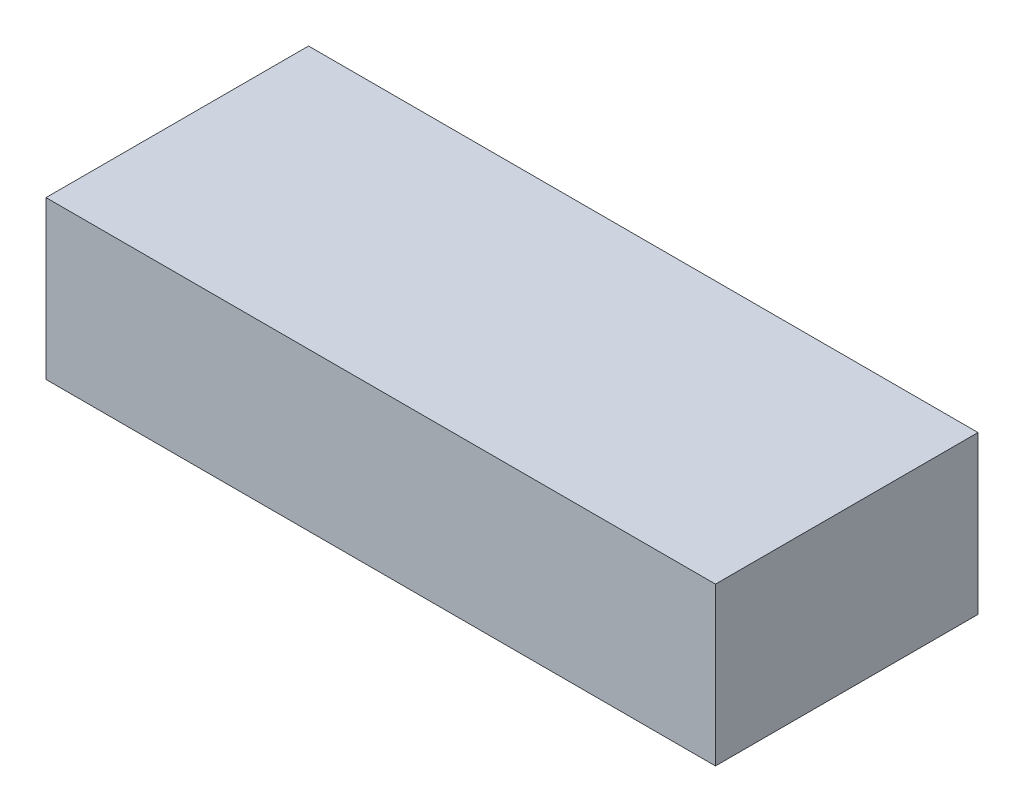
ISO-10303-21;
HEADER;
FILE_DESCRIPTION(('STEP AP214'),'2;1');
FILE_NAME('part.step','',(''),(''),'','','');
FILE_SCHEMA(('AUTOMOTIVE_DESIGN { 1 0 10303 214 1 1 1 1 }'));
ENDSEC;
DATA;
#1=APPLICATION_CONTEXT('core data for automotive mechanical design processes');
#2=APPLICATION_PROTOCOL_DEFINITION('international standard','automotive_design',2000,#1);
#3=PRODUCT_CONTEXT('',#1,'mechanical');
#4=PRODUCT('Part','Part','',(#3));
#5=PRODUCT_RELATED_PRODUCT_CATEGORY('part','',(#4));
#6=PRODUCT_DEFINITION_FORMATION('','',#4);
#7=PRODUCT_DEFINITION_CONTEXT('part definition',#1,'design');
#8=PRODUCT_DEFINITION('design','',#6,#7);
#9=PRODUCT_DEFINITION_SHAPE('','',#8);
#10=(LENGTH_UNIT() NAMED_UNIT(*) SI_UNIT(.MILLI.,.METRE.));
#11=(NAMED_UNIT(*) PLANE_ANGLE_UNIT() SI_UNIT($,.RADIAN.));
#12=(NAMED_UNIT(*) SI_UNIT($,.STERADIAN.) SOLID_ANGLE_UNIT());
#13=UNCERTAINTY_MEASURE_WITH_UNIT(LENGTH_MEASURE(1.E-05),#10,'distance_accuracy_value','');
#14=(GEOMETRIC_REPRESENTATION_CONTEXT(3) GLOBAL_UNCERTAINTY_ASSIGNED_CONTEXT((#13)) GLOBAL_UNIT_ASSIGNED_CONTEXT((#10,
#11,#12)) REPRESENTATION_CONTEXT('',''));
#15=CARTESIAN_POINT('',(0.,0.,0.));
#16=DIRECTION('',(0.,0.,1.));
#17=DIRECTION('',(1.,0.,0.));
#18=AXIS2_PLACEMENT_3D('',#15,#16,#17);
#19=CARTESIAN_POINT('',(-2.55,0.,-1.));
#20=DIRECTION('',(0.,1.,0.));
#21=DIRECTION('',(0.,0.,1.));
#22=AXIS2_PLACEMENT_3D('',#19,#20,#21);
#23=PLANE('',#22);
#24=DIRECTION('',(-1.,0.,0.));
#25=VECTOR('',#24,1.);
#26=CARTESIAN_POINT('',(0.,0.,1.));
#27=LINE('',#26,#25);
#28=CARTESIAN_POINT('',(2.55,0.,1.));
#29=VERTEX_POINT('',#28);
#30=CARTESIAN_POINT('',(-2.55,0.,1.));
#31=VERTEX_POINT('',#30);
#32=EDGE_CURVE('E82',#29,#31,#27,.T.);
#33=ORIENTED_EDGE('',*,*,#32,.T.);
#34=DIRECTION('',(0.,0.,-1.));
#35=VECTOR('',#34,1.);
#36=CARTESIAN_POINT('',(-2.55,0.,0.));
#37=LINE('',#36,#35);
#38=CARTESIAN_POINT('',(-2.55,0.,-1.));
#39=VERTEX_POINT('',#38);
#40=EDGE_CURVE('E69',#31,#39,#37,.T.);
#41=ORIENTED_EDGE('',*,*,#40,.T.);
#42=DIRECTION('',(1.,0.,0.));
#43=VECTOR('',#42,1.);
#44=CARTESIAN_POINT('',(0.,0.,-1.));
#45=LINE('',#44,#43);
#46=CARTESIAN_POINT('',(2.55,0.,-1.));
#47=VERTEX_POINT('',#46);
#48=EDGE_CURVE('E56',#39,#47,#45,.T.);
#49=ORIENTED_EDGE('',*,*,#48,.T.);
#50=DIRECTION('',(0.,0.,1.));
#51=VECTOR('',#50,1.);
#52=CARTESIAN_POINT('',(2.55,0.,0.));
#53=LINE('',#52,#51);
#54=EDGE_CURVE('E21',#47,#29,#53,.T.);
#55=ORIENTED_EDGE('',*,*,#54,.T.);
#56=EDGE_LOOP('',(#33,#41,#49,#55));
#57=FACE_BOUND('',#56,.T.);
#58=ADVANCED_FACE('F17',(#57),#23,.F.);
#59=CARTESIAN_POINT('',(2.55,0.,-1.));
#60=DIRECTION('',(-1.,0.,0.));
#61=DIRECTION('',(0.,0.,1.));
#62=AXIS2_PLACEMENT_3D('',#59,#60,#61);
#63=PLANE('',#62);
#64=DIRECTION('',(0.,1.,0.));
#65=VECTOR('',#64,1.);
#66=CARTESIAN_POINT('',(2.55,0.6,-1.));
#67=LINE('',#66,#65);
#68=CARTESIAN_POINT('',(2.55,1.2,-1.));
#69=VERTEX_POINT('',#68);
#70=EDGE_CURVE('E62',#47,#69,#67,.T.);
#71=ORIENTED_EDGE('',*,*,#70,.T.);
#72=DIRECTION('',(0.,0.,-1.));
#73=VECTOR('',#72,1.);
#74=CARTESIAN_POINT('',(2.55,1.2,0.));
#75=LINE('',#74,#73);
#76=CARTESIAN_POINT('',(2.55,1.2,1.));
#77=VERTEX_POINT('',#76);
#78=EDGE_CURVE('E84',#77,#69,#75,.T.);
#79=ORIENTED_EDGE('',*,*,#78,.F.);
#80=DIRECTION('',(0.,-1.,0.));
#81=VECTOR('',#80,1.);
#82=CARTESIAN_POINT('',(2.55,0.6,1.));
#83=LINE('',#82,#81);
#84=EDGE_CURVE('E65',#77,#29,#83,.T.);
#85=ORIENTED_EDGE('',*,*,#84,.T.);
#86=ORIENTED_EDGE('',*,*,#54,.F.);
#87=EDGE_LOOP('',(#71,#79,#85,#86));
#88=FACE_BOUND('',#87,.T.);
#89=ADVANCED_FACE('F61',(#88),#63,.F.);
#90=CARTESIAN_POINT('',(-2.55,0.,-1.));
#91=DIRECTION('',(0.,0.,1.));
#92=DIRECTION('',(1.,0.,0.));
#93=AXIS2_PLACEMENT_3D('',#90,#91,#92);
#94=PLANE('',#93);
#95=DIRECTION('',(0.,1.,0.));
#96=VECTOR('',#95,1.);
#97=CARTESIAN_POINT('',(-2.55,0.6,-1.));
#98=LINE('',#97,#96);
#99=CARTESIAN_POINT('',(-2.55,1.2,-1.));
#100=VERTEX_POINT('',#99);
#101=EDGE_CURVE('E71',#39,#100,#98,.T.);
#102=ORIENTED_EDGE('',*,*,#101,.T.);
#103=DIRECTION('',(-1.,0.,0.));
#104=VECTOR('',#103,1.);
#105=CARTESIAN_POINT('',(0.,1.2,-1.));
#106=LINE('',#105,#104);
#107=EDGE_CURVE('E75',#69,#100,#106,.T.);
#108=ORIENTED_EDGE('',*,*,#107,.F.);
#109=ORIENTED_EDGE('',*,*,#70,.F.);
#110=ORIENTED_EDGE('',*,*,#48,.F.);
#111=EDGE_LOOP('',(#102,#108,#109,#110));
#112=FACE_BOUND('',#111,.T.);
#113=ADVANCED_FACE('F73',(#112),#94,.F.);
#114=CARTESIAN_POINT('',(-2.55,0.,1.));
#115=DIRECTION('',(1.,0.,0.));
#116=DIRECTION('',(0.,0.,-1.));
#117=AXIS2_PLACEMENT_3D('',#114,#115,#116);
#118=PLANE('',#117);
#119=DIRECTION('',(0.,1.,0.));
#120=VECTOR('',#119,1.);
#121=CARTESIAN_POINT('',(-2.55,0.6,1.));
#122=LINE('',#121,#120);
#123=CARTESIAN_POINT('',(-2.55,1.2,1.));
#124=VERTEX_POINT('',#123);
#125=EDGE_CURVE('E36',#31,#124,#122,.T.);
#126=ORIENTED_EDGE('',*,*,#125,.T.);
#127=DIRECTION('',(0.,0.,1.));
#128=VECTOR('',#127,1.);
#129=CARTESIAN_POINT('',(-2.55,1.2,0.));
#130=LINE('',#129,#128);
#131=EDGE_CURVE('E27',#100,#124,#130,.T.);
#132=ORIENTED_EDGE('',*,*,#131,.F.);
#133=ORIENTED_EDGE('',*,*,#101,.F.);
#134=ORIENTED_EDGE('',*,*,#40,.F.);
#135=EDGE_LOOP('',(#126,#132,#133,#134));
#136=FACE_BOUND('',#135,.T.);
#137=ADVANCED_FACE('F89',(#136),#118,.F.);
#138=CARTESIAN_POINT('',(2.55,0.,1.));
#139=DIRECTION('',(0.,0.,-1.));
#140=DIRECTION('',(-1.,0.,0.));
#141=AXIS2_PLACEMENT_3D('',#138,#139,#140);
#142=PLANE('',#141);
#143=ORIENTED_EDGE('',*,*,#84,.F.);
#144=DIRECTION('',(1.,0.,0.));
#145=VECTOR('',#144,1.);
#146=CARTESIAN_POINT('',(0.,1.2,1.));
#147=LINE('',#146,#145);
#148=EDGE_CURVE('E11',#124,#77,#147,.T.);
#149=ORIENTED_EDGE('',*,*,#148,.F.);
#150=ORIENTED_EDGE('',*,*,#125,.F.);
#151=ORIENTED_EDGE('',*,*,#32,.F.);
#152=EDGE_LOOP('',(#143,#149,#150,#151));
#153=FACE_BOUND('',#152,.T.);
#154=ADVANCED_FACE('F91',(#153),#142,.F.);
#155=CARTESIAN_POINT('',(-2.55,1.2,-1.));
#156=DIRECTION('',(0.,1.,0.));
#157=DIRECTION('',(0.,0.,1.));
#158=AXIS2_PLACEMENT_3D('',#155,#156,#157);
#159=PLANE('',#158);
#160=ORIENTED_EDGE('',*,*,#131,.T.);
#161=ORIENTED_EDGE('',*,*,#148,.T.);
#162=ORIENTED_EDGE('',*,*,#78,.T.);
#163=ORIENTED_EDGE('',*,*,#107,.T.);
#164=EDGE_LOOP('',(#160,#161,#162,#163));
#165=FACE_BOUND('',#164,.T.);
#166=ADVANCED_FACE('F19',(#165),#159,.T.);
#167=CLOSED_SHELL('',(#58,#89,#113,#137,#154,#166));
#168=MANIFOLD_SOLID_BREP('B1',#167);
#169=ADVANCED_BREP_SHAPE_REPRESENTATION('',(#18,#168),#14);
#170=SHAPE_DEFINITION_REPRESENTATION(#9,#169);
ENDSEC;
END-ISO-10303-21;
